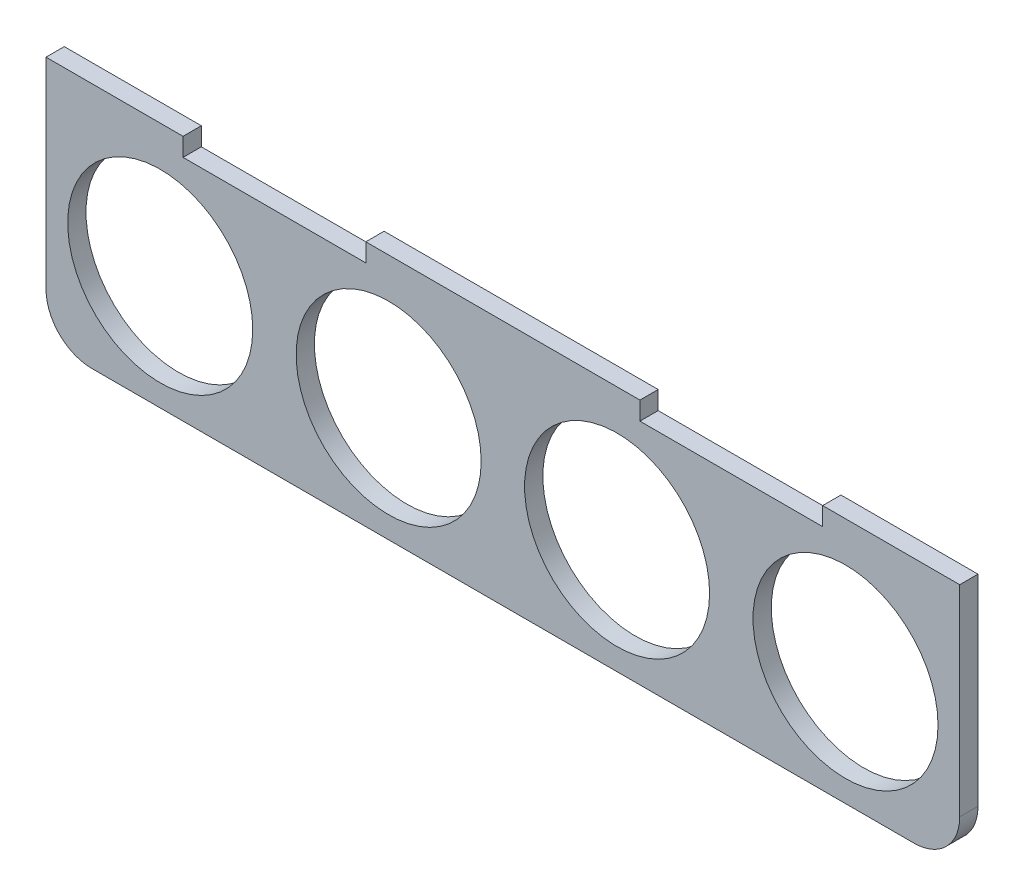
ISO-10303-21;
HEADER;
FILE_DESCRIPTION(('STEP AP214'),'2;1');
FILE_NAME('part.step','',(''),(''),'','','');
FILE_SCHEMA(('AUTOMOTIVE_DESIGN { 1 0 10303 214 1 1 1 1 }'));
ENDSEC;
DATA;
#1=APPLICATION_CONTEXT('core data for automotive mechanical design processes');
#2=APPLICATION_PROTOCOL_DEFINITION('international standard','automotive_design',2000,#1);
#3=PRODUCT_CONTEXT('',#1,'mechanical');
#4=PRODUCT('Part','Part','',(#3));
#5=PRODUCT_RELATED_PRODUCT_CATEGORY('part','',(#4));
#6=PRODUCT_DEFINITION_FORMATION('','',#4);
#7=PRODUCT_DEFINITION_CONTEXT('part definition',#1,'design');
#8=PRODUCT_DEFINITION('design','',#6,#7);
#9=PRODUCT_DEFINITION_SHAPE('','',#8);
#10=(LENGTH_UNIT() NAMED_UNIT(*) SI_UNIT(.MILLI.,.METRE.));
#11=(NAMED_UNIT(*) PLANE_ANGLE_UNIT() SI_UNIT($,.RADIAN.));
#12=(NAMED_UNIT(*) SI_UNIT($,.STERADIAN.) SOLID_ANGLE_UNIT());
#13=UNCERTAINTY_MEASURE_WITH_UNIT(LENGTH_MEASURE(1.E-05),#10,'distance_accuracy_value','');
#14=(GEOMETRIC_REPRESENTATION_CONTEXT(3) GLOBAL_UNCERTAINTY_ASSIGNED_CONTEXT((#13)) GLOBAL_UNIT_ASSIGNED_CONTEXT((#10,
#11,#12)) REPRESENTATION_CONTEXT('',''));
#15=CARTESIAN_POINT('',(0.,0.,0.));
#16=DIRECTION('',(0.,0.,1.));
#17=DIRECTION('',(1.,0.,0.));
#18=AXIS2_PLACEMENT_3D('',#15,#16,#17);
#19=CARTESIAN_POINT('',(10.,10.,4.));
#20=DIRECTION('',(0.,0.,-1.));
#21=DIRECTION('',(-1.,0.,0.));
#22=AXIS2_PLACEMENT_3D('',#19,#20,#21);
#23=PLANE('',#22);
#24=DIRECTION('',(0.,1.,0.));
#25=VECTOR('',#24,1.);
#26=CARTESIAN_POINT('',(200.,50.,4.));
#27=LINE('',#26,#25);
#28=CARTESIAN_POINT('',(200.,10.0000000000001,4.));
#29=VERTEX_POINT('',#28);
#30=CARTESIAN_POINT('',(200.,54.,4.));
#31=VERTEX_POINT('',#30);
#32=EDGE_CURVE('E52',#29,#31,#27,.T.);
#33=ORIENTED_EDGE('',*,*,#32,.T.);
#34=DIRECTION('',(-1.,0.,0.));
#35=VECTOR('',#34,1.);
#36=CARTESIAN_POINT('',(200.,54.,4.));
#37=LINE('',#36,#35);
#38=CARTESIAN_POINT('',(170.,54.,4.));
#39=VERTEX_POINT('',#38);
#40=EDGE_CURVE('E114',#31,#39,#37,.T.);
#41=ORIENTED_EDGE('',*,*,#40,.T.);
#42=DIRECTION('',(0.,-1.,0.));
#43=VECTOR('',#42,1.);
#44=CARTESIAN_POINT('',(170.,50.,4.));
#45=LINE('',#44,#43);
#46=CARTESIAN_POINT('',(170.,50.,4.));
#47=VERTEX_POINT('',#46);
#48=EDGE_CURVE('E231',#39,#47,#45,.T.);
#49=ORIENTED_EDGE('',*,*,#48,.T.);
#50=DIRECTION('',(-1.,0.,0.));
#51=VECTOR('',#50,1.);
#52=CARTESIAN_POINT('',(130.,50.,4.));
#53=LINE('',#52,#51);
#54=CARTESIAN_POINT('',(130.,50.,4.));
#55=VERTEX_POINT('',#54);
#56=EDGE_CURVE('E251',#47,#55,#53,.T.);
#57=ORIENTED_EDGE('',*,*,#56,.T.);
#58=DIRECTION('',(0.,1.,0.));
#59=VECTOR('',#58,1.);
#60=CARTESIAN_POINT('',(130.,50.,4.));
#61=LINE('',#60,#59);
#62=CARTESIAN_POINT('',(130.,54.,4.));
#63=VERTEX_POINT('',#62);
#64=EDGE_CURVE('E248',#55,#63,#61,.T.);
#65=ORIENTED_EDGE('',*,*,#64,.T.);
#66=DIRECTION('',(-1.,0.,0.));
#67=VECTOR('',#66,1.);
#68=CARTESIAN_POINT('',(70.,54.,4.));
#69=LINE('',#68,#67);
#70=CARTESIAN_POINT('',(70.,54.,4.));
#71=VERTEX_POINT('',#70);
#72=EDGE_CURVE('E250',#63,#71,#69,.T.);
#73=ORIENTED_EDGE('',*,*,#72,.T.);
#74=DIRECTION('',(0.,-1.,0.));
#75=VECTOR('',#74,1.);
#76=CARTESIAN_POINT('',(70.,50.,4.));
#77=LINE('',#76,#75);
#78=CARTESIAN_POINT('',(70.,50.,4.));
#79=VERTEX_POINT('',#78);
#80=EDGE_CURVE('E253',#71,#79,#77,.T.);
#81=ORIENTED_EDGE('',*,*,#80,.T.);
#82=DIRECTION('',(-1.,0.,0.));
#83=VECTOR('',#82,1.);
#84=CARTESIAN_POINT('',(30.,50.,4.));
#85=LINE('',#84,#83);
#86=CARTESIAN_POINT('',(30.,50.,4.));
#87=VERTEX_POINT('',#86);
#88=EDGE_CURVE('E259',#79,#87,#85,.T.);
#89=ORIENTED_EDGE('',*,*,#88,.T.);
#90=DIRECTION('',(0.,1.,0.));
#91=VECTOR('',#90,1.);
#92=CARTESIAN_POINT('',(30.,50.,4.));
#93=LINE('',#92,#91);
#94=CARTESIAN_POINT('',(30.,54.,4.));
#95=VERTEX_POINT('',#94);
#96=EDGE_CURVE('E261',#87,#95,#93,.T.);
#97=ORIENTED_EDGE('',*,*,#96,.T.);
#98=DIRECTION('',(-1.,0.,0.));
#99=VECTOR('',#98,1.);
#100=CARTESIAN_POINT('',(0.,54.,4.));
#101=LINE('',#100,#99);
#102=CARTESIAN_POINT('',(0.,54.,4.));
#103=VERTEX_POINT('',#102);
#104=EDGE_CURVE('E263',#95,#103,#101,.T.);
#105=ORIENTED_EDGE('',*,*,#104,.T.);
#106=DIRECTION('',(0.,-1.,0.));
#107=VECTOR('',#106,1.);
#108=CARTESIAN_POINT('',(0.,50.,4.));
#109=LINE('',#108,#107);
#110=CARTESIAN_POINT('',(0.,10.,4.));
#111=VERTEX_POINT('',#110);
#112=EDGE_CURVE('E152',#103,#111,#109,.T.);
#113=ORIENTED_EDGE('',*,*,#112,.T.);
#114=CARTESIAN_POINT('',(10.,10.,4.));
#115=DIRECTION('',(0.,0.,1.));
#116=DIRECTION('',(-1.,0.,0.));
#117=AXIS2_PLACEMENT_3D('',#114,#115,#116);
#118=CIRCLE('',#117,10.);
#119=CARTESIAN_POINT('',(10.0000000000001,0.,4.));
#120=VERTEX_POINT('',#119);
#121=EDGE_CURVE('E146',#111,#120,#118,.T.);
#122=ORIENTED_EDGE('',*,*,#121,.T.);
#123=DIRECTION('',(1.,0.,0.));
#124=VECTOR('',#123,1.);
#125=CARTESIAN_POINT('',(10.0000000000001,0.,4.));
#126=LINE('',#125,#124);
#127=CARTESIAN_POINT('',(190.,0.,4.));
#128=VERTEX_POINT('',#127);
#129=EDGE_CURVE('E150',#120,#128,#126,.T.);
#130=ORIENTED_EDGE('',*,*,#129,.T.);
#131=CARTESIAN_POINT('',(190.,10.,4.));
#132=DIRECTION('',(0.,0.,1.));
#133=DIRECTION('',(1.,0.,0.));
#134=AXIS2_PLACEMENT_3D('',#131,#132,#133);
#135=CIRCLE('',#134,10.);
#136=EDGE_CURVE('E166',#128,#29,#135,.T.);
#137=ORIENTED_EDGE('',*,*,#136,.T.);
#138=EDGE_LOOP('',(#33,#41,#49,#57,#65,#73,#81,#89,#97,#105,#113,#122,#130,#137));
#139=FACE_BOUND('',#138,.T.);
#140=CARTESIAN_POINT('',(25.,25.,4.));
#141=DIRECTION('',(0.,0.,1.));
#142=DIRECTION('',(1.,0.,0.));
#143=AXIS2_PLACEMENT_3D('',#140,#141,#142);
#144=CIRCLE('',#143,20.25);
#145=CARTESIAN_POINT('',(45.25,25.,4.));
#146=VERTEX_POINT('',#145);
#147=EDGE_CURVE('E175',#146,#146,#144,.T.);
#148=ORIENTED_EDGE('',*,*,#147,.F.);
#149=EDGE_LOOP('',(#148));
#150=FACE_BOUND('',#149,.T.);
#151=CARTESIAN_POINT('',(75.,25.,4.));
#152=DIRECTION('',(0.,0.,1.));
#153=DIRECTION('',(1.,0.,0.));
#154=AXIS2_PLACEMENT_3D('',#151,#152,#153);
#155=CIRCLE('',#154,20.25);
#156=CARTESIAN_POINT('',(95.25,25.,4.));
#157=VERTEX_POINT('',#156);
#158=EDGE_CURVE('E281',#157,#157,#155,.T.);
#159=ORIENTED_EDGE('',*,*,#158,.F.);
#160=EDGE_LOOP('',(#159));
#161=FACE_BOUND('',#160,.T.);
#162=CARTESIAN_POINT('',(125.,25.,4.));
#163=DIRECTION('',(0.,0.,1.));
#164=DIRECTION('',(1.,0.,0.));
#165=AXIS2_PLACEMENT_3D('',#162,#163,#164);
#166=CIRCLE('',#165,20.25);
#167=CARTESIAN_POINT('',(145.25,25.,4.));
#168=VERTEX_POINT('',#167);
#169=EDGE_CURVE('E287',#168,#168,#166,.T.);
#170=ORIENTED_EDGE('',*,*,#169,.F.);
#171=EDGE_LOOP('',(#170));
#172=FACE_BOUND('',#171,.T.);
#173=CARTESIAN_POINT('',(175.,25.,4.));
#174=DIRECTION('',(0.,0.,1.));
#175=DIRECTION('',(1.,0.,0.));
#176=AXIS2_PLACEMENT_3D('',#173,#174,#175);
#177=CIRCLE('',#176,20.25);
#178=CARTESIAN_POINT('',(195.25,25.,4.));
#179=VERTEX_POINT('',#178);
#180=EDGE_CURVE('E293',#179,#179,#177,.T.);
#181=ORIENTED_EDGE('',*,*,#180,.F.);
#182=EDGE_LOOP('',(#181));
#183=FACE_BOUND('',#182,.T.);
#184=ADVANCED_FACE('F35',(#139,#150,#161,#172,#183),#23,.F.);
#185=CARTESIAN_POINT('',(10.,10.,0.));
#186=DIRECTION('',(0.,0.,-1.));
#187=DIRECTION('',(-1.,0.,0.));
#188=AXIS2_PLACEMENT_3D('',#185,#186,#187);
#189=PLANE('',#188);
#190=CARTESIAN_POINT('',(125.,25.,0.));
#191=DIRECTION('',(0.,0.,1.));
#192=DIRECTION('',(1.,0.,0.));
#193=AXIS2_PLACEMENT_3D('',#190,#191,#192);
#194=CIRCLE('',#193,20.25);
#195=CARTESIAN_POINT('',(145.25,25.,0.));
#196=VERTEX_POINT('',#195);
#197=EDGE_CURVE('E290',#196,#196,#194,.T.);
#198=ORIENTED_EDGE('',*,*,#197,.T.);
#199=EDGE_LOOP('',(#198));
#200=FACE_BOUND('',#199,.T.);
#201=CARTESIAN_POINT('',(25.,25.,0.));
#202=DIRECTION('',(0.,0.,1.));
#203=DIRECTION('',(1.,0.,0.));
#204=AXIS2_PLACEMENT_3D('',#201,#202,#203);
#205=CIRCLE('',#204,20.25);
#206=CARTESIAN_POINT('',(45.25,25.,0.));
#207=VERTEX_POINT('',#206);
#208=EDGE_CURVE('E278',#207,#207,#205,.T.);
#209=ORIENTED_EDGE('',*,*,#208,.T.);
#210=EDGE_LOOP('',(#209));
#211=FACE_BOUND('',#210,.T.);
#212=DIRECTION('',(-1.,0.,0.));
#213=VECTOR('',#212,1.);
#214=CARTESIAN_POINT('',(200.,54.,0.));
#215=LINE('',#214,#213);
#216=CARTESIAN_POINT('',(200.,54.,0.));
#217=VERTEX_POINT('',#216);
#218=CARTESIAN_POINT('',(170.,54.,0.));
#219=VERTEX_POINT('',#218);
#220=EDGE_CURVE('E172',#217,#219,#215,.T.);
#221=ORIENTED_EDGE('',*,*,#220,.F.);
#222=DIRECTION('',(0.,1.,0.));
#223=VECTOR('',#222,1.);
#224=CARTESIAN_POINT('',(200.,10.0000000000001,0.));
#225=LINE('',#224,#223);
#226=CARTESIAN_POINT('',(200.,10.0000000000001,0.));
#227=VERTEX_POINT('',#226);
#228=EDGE_CURVE('E197',#227,#217,#225,.T.);
#229=ORIENTED_EDGE('',*,*,#228,.F.);
#230=CARTESIAN_POINT('',(190.,10.,0.));
#231=DIRECTION('',(0.,0.,1.));
#232=DIRECTION('',(1.,0.,0.));
#233=AXIS2_PLACEMENT_3D('',#230,#231,#232);
#234=CIRCLE('',#233,10.);
#235=CARTESIAN_POINT('',(190.,0.,0.));
#236=VERTEX_POINT('',#235);
#237=EDGE_CURVE('E107',#236,#227,#234,.T.);
#238=ORIENTED_EDGE('',*,*,#237,.F.);
#239=DIRECTION('',(1.,0.,0.));
#240=VECTOR('',#239,1.);
#241=CARTESIAN_POINT('',(10.0000000000001,0.,0.));
#242=LINE('',#241,#240);
#243=CARTESIAN_POINT('',(10.0000000000001,0.,0.));
#244=VERTEX_POINT('',#243);
#245=EDGE_CURVE('E100',#244,#236,#242,.T.);
#246=ORIENTED_EDGE('',*,*,#245,.F.);
#247=CARTESIAN_POINT('',(10.,10.,0.));
#248=DIRECTION('',(0.,0.,1.));
#249=DIRECTION('',(-1.,0.,0.));
#250=AXIS2_PLACEMENT_3D('',#247,#248,#249);
#251=CIRCLE('',#250,10.);
#252=CARTESIAN_POINT('',(0.,10.,0.));
#253=VERTEX_POINT('',#252);
#254=EDGE_CURVE('E160',#253,#244,#251,.T.);
#255=ORIENTED_EDGE('',*,*,#254,.F.);
#256=DIRECTION('',(0.,-1.,0.));
#257=VECTOR('',#256,1.);
#258=CARTESIAN_POINT('',(0.,10.0000000000001,0.));
#259=LINE('',#258,#257);
#260=CARTESIAN_POINT('',(0.,54.,0.));
#261=VERTEX_POINT('',#260);
#262=EDGE_CURVE('E192',#261,#253,#259,.T.);
#263=ORIENTED_EDGE('',*,*,#262,.F.);
#264=DIRECTION('',(-1.,0.,0.));
#265=VECTOR('',#264,1.);
#266=CARTESIAN_POINT('',(0.,54.,0.));
#267=LINE('',#266,#265);
#268=CARTESIAN_POINT('',(30.,54.,0.));
#269=VERTEX_POINT('',#268);
#270=EDGE_CURVE('E189',#269,#261,#267,.T.);
#271=ORIENTED_EDGE('',*,*,#270,.F.);
#272=DIRECTION('',(0.,1.,0.));
#273=VECTOR('',#272,1.);
#274=CARTESIAN_POINT('',(30.,50.,0.));
#275=LINE('',#274,#273);
#276=CARTESIAN_POINT('',(30.,50.,0.));
#277=VERTEX_POINT('',#276);
#278=EDGE_CURVE('E187',#277,#269,#275,.T.);
#279=ORIENTED_EDGE('',*,*,#278,.F.);
#280=DIRECTION('',(-1.,0.,0.));
#281=VECTOR('',#280,1.);
#282=CARTESIAN_POINT('',(30.,50.,0.));
#283=LINE('',#282,#281);
#284=CARTESIAN_POINT('',(70.,50.,0.));
#285=VERTEX_POINT('',#284);
#286=EDGE_CURVE('E185',#285,#277,#283,.T.);
#287=ORIENTED_EDGE('',*,*,#286,.F.);
#288=DIRECTION('',(0.,-1.,0.));
#289=VECTOR('',#288,1.);
#290=CARTESIAN_POINT('',(70.,50.,0.));
#291=LINE('',#290,#289);
#292=CARTESIAN_POINT('',(70.,54.,0.));
#293=VERTEX_POINT('',#292);
#294=EDGE_CURVE('E183',#293,#285,#291,.T.);
#295=ORIENTED_EDGE('',*,*,#294,.F.);
#296=DIRECTION('',(-1.,0.,0.));
#297=VECTOR('',#296,1.);
#298=CARTESIAN_POINT('',(70.,54.,0.));
#299=LINE('',#298,#297);
#300=CARTESIAN_POINT('',(130.,54.,0.));
#301=VERTEX_POINT('',#300);
#302=EDGE_CURVE('E181',#301,#293,#299,.T.);
#303=ORIENTED_EDGE('',*,*,#302,.F.);
#304=DIRECTION('',(0.,1.,0.));
#305=VECTOR('',#304,1.);
#306=CARTESIAN_POINT('',(130.,50.,0.));
#307=LINE('',#306,#305);
#308=CARTESIAN_POINT('',(130.,50.,0.));
#309=VERTEX_POINT('',#308);
#310=EDGE_CURVE('E179',#309,#301,#307,.T.);
#311=ORIENTED_EDGE('',*,*,#310,.F.);
#312=DIRECTION('',(-1.,0.,0.));
#313=VECTOR('',#312,1.);
#314=CARTESIAN_POINT('',(130.,50.,0.));
#315=LINE('',#314,#313);
#316=CARTESIAN_POINT('',(170.,50.,0.));
#317=VERTEX_POINT('',#316);
#318=EDGE_CURVE('E177',#317,#309,#315,.T.);
#319=ORIENTED_EDGE('',*,*,#318,.F.);
#320=DIRECTION('',(0.,-1.,0.));
#321=VECTOR('',#320,1.);
#322=CARTESIAN_POINT('',(170.,50.,0.));
#323=LINE('',#322,#321);
#324=EDGE_CURVE('E174',#219,#317,#323,.T.);
#325=ORIENTED_EDGE('',*,*,#324,.F.);
#326=EDGE_LOOP('',(#221,#229,#238,#246,#255,#263,#271,#279,#287,#295,#303,#311,#319,#325));
#327=FACE_BOUND('',#326,.T.);
#328=CARTESIAN_POINT('',(75.,25.,0.));
#329=DIRECTION('',(0.,0.,1.));
#330=DIRECTION('',(1.,0.,0.));
#331=AXIS2_PLACEMENT_3D('',#328,#329,#330);
#332=CIRCLE('',#331,20.25);
#333=CARTESIAN_POINT('',(95.25,25.,0.));
#334=VERTEX_POINT('',#333);
#335=EDGE_CURVE('E284',#334,#334,#332,.T.);
#336=ORIENTED_EDGE('',*,*,#335,.T.);
#337=EDGE_LOOP('',(#336));
#338=FACE_BOUND('',#337,.T.);
#339=CARTESIAN_POINT('',(175.,25.,0.));
#340=DIRECTION('',(0.,0.,1.));
#341=DIRECTION('',(1.,0.,0.));
#342=AXIS2_PLACEMENT_3D('',#339,#340,#341);
#343=CIRCLE('',#342,20.25);
#344=CARTESIAN_POINT('',(195.25,25.,0.));
#345=VERTEX_POINT('',#344);
#346=EDGE_CURVE('E296',#345,#345,#343,.T.);
#347=ORIENTED_EDGE('',*,*,#346,.T.);
#348=EDGE_LOOP('',(#347));
#349=FACE_BOUND('',#348,.T.);
#350=ADVANCED_FACE('F235',(#200,#211,#327,#338,#349),#189,.T.);
#351=CARTESIAN_POINT('',(200.,54.,4.));
#352=DIRECTION('',(0.,-1.,0.));
#353=DIRECTION('',(1.,0.,0.));
#354=AXIS2_PLACEMENT_3D('',#351,#352,#353);
#355=PLANE('',#354);
#356=ORIENTED_EDGE('',*,*,#220,.T.);
#357=DIRECTION('',(0.,0.,-1.));
#358=VECTOR('',#357,1.);
#359=CARTESIAN_POINT('',(170.,54.,4.));
#360=LINE('',#359,#358);
#361=EDGE_CURVE('E44',#39,#219,#360,.T.);
#362=ORIENTED_EDGE('',*,*,#361,.F.);
#363=ORIENTED_EDGE('',*,*,#40,.F.);
#364=DIRECTION('',(0.,0.,-1.));
#365=VECTOR('',#364,1.);
#366=CARTESIAN_POINT('',(200.,54.,4.));
#367=LINE('',#366,#365);
#368=EDGE_CURVE('E11',#31,#217,#367,.T.);
#369=ORIENTED_EDGE('',*,*,#368,.T.);
#370=EDGE_LOOP('',(#356,#362,#363,#369));
#371=FACE_BOUND('',#370,.T.);
#372=ADVANCED_FACE('F37',(#371),#355,.F.);
#373=CARTESIAN_POINT('',(170.,50.,4.));
#374=DIRECTION('',(1.,0.,0.));
#375=DIRECTION('',(0.,0.,-1.));
#376=AXIS2_PLACEMENT_3D('',#373,#374,#375);
#377=PLANE('',#376);
#378=ORIENTED_EDGE('',*,*,#324,.T.);
#379=DIRECTION('',(0.,0.,-1.));
#380=VECTOR('',#379,1.);
#381=CARTESIAN_POINT('',(170.,50.,4.));
#382=LINE('',#381,#380);
#383=EDGE_CURVE('E223',#47,#317,#382,.T.);
#384=ORIENTED_EDGE('',*,*,#383,.F.);
#385=ORIENTED_EDGE('',*,*,#48,.F.);
#386=ORIENTED_EDGE('',*,*,#361,.T.);
#387=EDGE_LOOP('',(#378,#384,#385,#386));
#388=FACE_BOUND('',#387,.T.);
#389=ADVANCED_FACE('F229',(#388),#377,.F.);
#390=CARTESIAN_POINT('',(130.,50.,4.));
#391=DIRECTION('',(0.,-1.,0.));
#392=DIRECTION('',(1.,0.,0.));
#393=AXIS2_PLACEMENT_3D('',#390,#391,#392);
#394=PLANE('',#393);
#395=ORIENTED_EDGE('',*,*,#318,.T.);
#396=DIRECTION('',(0.,0.,-1.));
#397=VECTOR('',#396,1.);
#398=CARTESIAN_POINT('',(130.,50.,4.));
#399=LINE('',#398,#397);
#400=EDGE_CURVE('E220',#55,#309,#399,.T.);
#401=ORIENTED_EDGE('',*,*,#400,.F.);
#402=ORIENTED_EDGE('',*,*,#56,.F.);
#403=ORIENTED_EDGE('',*,*,#383,.T.);
#404=EDGE_LOOP('',(#395,#401,#402,#403));
#405=FACE_BOUND('',#404,.T.);
#406=ADVANCED_FACE('F242',(#405),#394,.F.);
#407=CARTESIAN_POINT('',(130.,50.,4.));
#408=DIRECTION('',(-1.,0.,0.));
#409=DIRECTION('',(0.,0.,1.));
#410=AXIS2_PLACEMENT_3D('',#407,#408,#409);
#411=PLANE('',#410);
#412=ORIENTED_EDGE('',*,*,#310,.T.);
#413=DIRECTION('',(0.,0.,-1.));
#414=VECTOR('',#413,1.);
#415=CARTESIAN_POINT('',(130.,54.,4.));
#416=LINE('',#415,#414);
#417=EDGE_CURVE('E217',#63,#301,#416,.T.);
#418=ORIENTED_EDGE('',*,*,#417,.F.);
#419=ORIENTED_EDGE('',*,*,#64,.F.);
#420=ORIENTED_EDGE('',*,*,#400,.T.);
#421=EDGE_LOOP('',(#412,#418,#419,#420));
#422=FACE_BOUND('',#421,.T.);
#423=ADVANCED_FACE('F246',(#422),#411,.F.);
#424=CARTESIAN_POINT('',(70.,54.,4.));
#425=DIRECTION('',(0.,-1.,0.));
#426=DIRECTION('',(0.,0.,-1.));
#427=AXIS2_PLACEMENT_3D('',#424,#425,#426);
#428=PLANE('',#427);
#429=ORIENTED_EDGE('',*,*,#302,.T.);
#430=DIRECTION('',(0.,0.,-1.));
#431=VECTOR('',#430,1.);
#432=CARTESIAN_POINT('',(70.,54.,4.));
#433=LINE('',#432,#431);
#434=EDGE_CURVE('E214',#71,#293,#433,.T.);
#435=ORIENTED_EDGE('',*,*,#434,.F.);
#436=ORIENTED_EDGE('',*,*,#72,.F.);
#437=ORIENTED_EDGE('',*,*,#417,.T.);
#438=EDGE_LOOP('',(#429,#435,#436,#437));
#439=FACE_BOUND('',#438,.T.);
#440=ADVANCED_FACE('F339',(#439),#428,.F.);
#441=CARTESIAN_POINT('',(70.,50.,4.));
#442=DIRECTION('',(1.,0.,0.));
#443=DIRECTION('',(0.,0.,-1.));
#444=AXIS2_PLACEMENT_3D('',#441,#442,#443);
#445=PLANE('',#444);
#446=ORIENTED_EDGE('',*,*,#294,.T.);
#447=DIRECTION('',(0.,0.,-1.));
#448=VECTOR('',#447,1.);
#449=CARTESIAN_POINT('',(70.,50.,4.));
#450=LINE('',#449,#448);
#451=EDGE_CURVE('E211',#79,#285,#450,.T.);
#452=ORIENTED_EDGE('',*,*,#451,.F.);
#453=ORIENTED_EDGE('',*,*,#80,.F.);
#454=ORIENTED_EDGE('',*,*,#434,.T.);
#455=EDGE_LOOP('',(#446,#452,#453,#454));
#456=FACE_BOUND('',#455,.T.);
#457=ADVANCED_FACE('F335',(#456),#445,.F.);
#458=CARTESIAN_POINT('',(30.,50.,4.));
#459=DIRECTION('',(0.,-1.,0.));
#460=DIRECTION('',(0.,0.,-1.));
#461=AXIS2_PLACEMENT_3D('',#458,#459,#460);
#462=PLANE('',#461);
#463=ORIENTED_EDGE('',*,*,#286,.T.);
#464=DIRECTION('',(0.,0.,-1.));
#465=VECTOR('',#464,1.);
#466=CARTESIAN_POINT('',(30.,50.,4.));
#467=LINE('',#466,#465);
#468=EDGE_CURVE('E208',#87,#277,#467,.T.);
#469=ORIENTED_EDGE('',*,*,#468,.F.);
#470=ORIENTED_EDGE('',*,*,#88,.F.);
#471=ORIENTED_EDGE('',*,*,#451,.T.);
#472=EDGE_LOOP('',(#463,#469,#470,#471));
#473=FACE_BOUND('',#472,.T.);
#474=ADVANCED_FACE('F331',(#473),#462,.F.);
#475=CARTESIAN_POINT('',(30.,50.,4.));
#476=DIRECTION('',(-1.,0.,0.));
#477=DIRECTION('',(0.,0.,1.));
#478=AXIS2_PLACEMENT_3D('',#475,#476,#477);
#479=PLANE('',#478);
#480=ORIENTED_EDGE('',*,*,#278,.T.);
#481=DIRECTION('',(0.,0.,-1.));
#482=VECTOR('',#481,1.);
#483=CARTESIAN_POINT('',(30.,54.,4.));
#484=LINE('',#483,#482);
#485=EDGE_CURVE('E205',#95,#269,#484,.T.);
#486=ORIENTED_EDGE('',*,*,#485,.F.);
#487=ORIENTED_EDGE('',*,*,#96,.F.);
#488=ORIENTED_EDGE('',*,*,#468,.T.);
#489=EDGE_LOOP('',(#480,#486,#487,#488));
#490=FACE_BOUND('',#489,.T.);
#491=ADVANCED_FACE('F328',(#490),#479,.F.);
#492=CARTESIAN_POINT('',(0.,54.,4.));
#493=DIRECTION('',(0.,-1.,0.));
#494=DIRECTION('',(0.,0.,-1.));
#495=AXIS2_PLACEMENT_3D('',#492,#493,#494);
#496=PLANE('',#495);
#497=ORIENTED_EDGE('',*,*,#270,.T.);
#498=DIRECTION('',(0.,0.,-1.));
#499=VECTOR('',#498,1.);
#500=CARTESIAN_POINT('',(0.,54.,4.));
#501=LINE('',#500,#499);
#502=EDGE_CURVE('E202',#103,#261,#501,.T.);
#503=ORIENTED_EDGE('',*,*,#502,.F.);
#504=ORIENTED_EDGE('',*,*,#104,.F.);
#505=ORIENTED_EDGE('',*,*,#485,.T.);
#506=EDGE_LOOP('',(#497,#503,#504,#505));
#507=FACE_BOUND('',#506,.T.);
#508=ADVANCED_FACE('F269',(#507),#496,.F.);
#509=CARTESIAN_POINT('',(0.,10.0000000000001,4.));
#510=DIRECTION('',(1.,0.,0.));
#511=DIRECTION('',(0.,0.,-1.));
#512=AXIS2_PLACEMENT_3D('',#509,#510,#511);
#513=PLANE('',#512);
#514=ORIENTED_EDGE('',*,*,#262,.T.);
#515=DIRECTION('',(0.,0.,-1.));
#516=VECTOR('',#515,1.);
#517=CARTESIAN_POINT('',(0.,10.,4.));
#518=LINE('',#517,#516);
#519=EDGE_CURVE('E161',#111,#253,#518,.T.);
#520=ORIENTED_EDGE('',*,*,#519,.F.);
#521=ORIENTED_EDGE('',*,*,#112,.F.);
#522=ORIENTED_EDGE('',*,*,#502,.T.);
#523=EDGE_LOOP('',(#514,#520,#521,#522));
#524=FACE_BOUND('',#523,.T.);
#525=ADVANCED_FACE('F272',(#524),#513,.F.);
#526=CARTESIAN_POINT('',(10.,10.,4.));
#527=DIRECTION('',(0.,0.,-1.));
#528=DIRECTION('',(-1.,0.,0.));
#529=AXIS2_PLACEMENT_3D('',#526,#527,#528);
#530=CYLINDRICAL_SURFACE('',#529,10.);
#531=ORIENTED_EDGE('',*,*,#254,.T.);
#532=DIRECTION('',(0.,0.,-1.));
#533=VECTOR('',#532,1.);
#534=CARTESIAN_POINT('',(10.0000000000001,0.,4.));
#535=LINE('',#534,#533);
#536=EDGE_CURVE('E157',#120,#244,#535,.T.);
#537=ORIENTED_EDGE('',*,*,#536,.F.);
#538=ORIENTED_EDGE('',*,*,#121,.F.);
#539=ORIENTED_EDGE('',*,*,#519,.T.);
#540=EDGE_LOOP('',(#531,#537,#538,#539));
#541=FACE_BOUND('',#540,.T.);
#542=ADVANCED_FACE('F158',(#541),#530,.T.);
#543=CARTESIAN_POINT('',(10.0000000000001,0.,4.));
#544=DIRECTION('',(0.,1.,0.));
#545=DIRECTION('',(0.,0.,1.));
#546=AXIS2_PLACEMENT_3D('',#543,#544,#545);
#547=PLANE('',#546);
#548=ORIENTED_EDGE('',*,*,#245,.T.);
#549=DIRECTION('',(0.,0.,-1.));
#550=VECTOR('',#549,1.);
#551=CARTESIAN_POINT('',(190.,0.,4.));
#552=LINE('',#551,#550);
#553=EDGE_CURVE('E162',#128,#236,#552,.T.);
#554=ORIENTED_EDGE('',*,*,#553,.F.);
#555=ORIENTED_EDGE('',*,*,#129,.F.);
#556=ORIENTED_EDGE('',*,*,#536,.T.);
#557=EDGE_LOOP('',(#548,#554,#555,#556));
#558=FACE_BOUND('',#557,.T.);
#559=ADVANCED_FACE('F164',(#558),#547,.F.);
#560=CARTESIAN_POINT('',(190.,10.,4.));
#561=DIRECTION('',(0.,0.,-1.));
#562=DIRECTION('',(-1.,0.,0.));
#563=AXIS2_PLACEMENT_3D('',#560,#561,#562);
#564=CYLINDRICAL_SURFACE('',#563,10.);
#565=ORIENTED_EDGE('',*,*,#237,.T.);
#566=DIRECTION('',(0.,0.,-1.));
#567=VECTOR('',#566,1.);
#568=CARTESIAN_POINT('',(200.,10.0000000000001,4.));
#569=LINE('',#568,#567);
#570=EDGE_CURVE('E168',#29,#227,#569,.T.);
#571=ORIENTED_EDGE('',*,*,#570,.F.);
#572=ORIENTED_EDGE('',*,*,#136,.F.);
#573=ORIENTED_EDGE('',*,*,#553,.T.);
#574=EDGE_LOOP('',(#565,#571,#572,#573));
#575=FACE_BOUND('',#574,.T.);
#576=ADVANCED_FACE('F274',(#575),#564,.T.);
#577=CARTESIAN_POINT('',(200.,10.0000000000001,4.));
#578=DIRECTION('',(-1.,0.,0.));
#579=DIRECTION('',(0.,0.,1.));
#580=AXIS2_PLACEMENT_3D('',#577,#578,#579);
#581=PLANE('',#580);
#582=ORIENTED_EDGE('',*,*,#228,.T.);
#583=ORIENTED_EDGE('',*,*,#368,.F.);
#584=ORIENTED_EDGE('',*,*,#32,.F.);
#585=ORIENTED_EDGE('',*,*,#570,.T.);
#586=EDGE_LOOP('',(#582,#583,#584,#585));
#587=FACE_BOUND('',#586,.T.);
#588=ADVANCED_FACE('F273',(#587),#581,.F.);
#589=CARTESIAN_POINT('',(25.,25.,4.));
#590=DIRECTION('',(0.,0.,-1.));
#591=DIRECTION('',(-1.,0.,0.));
#592=AXIS2_PLACEMENT_3D('',#589,#590,#591);
#593=CYLINDRICAL_SURFACE('',#592,20.25);
#594=ORIENTED_EDGE('',*,*,#147,.T.);
#595=EDGE_LOOP('',(#594));
#596=FACE_BOUND('',#595,.T.);
#597=ORIENTED_EDGE('',*,*,#208,.F.);
#598=EDGE_LOOP('',(#597));
#599=FACE_BOUND('',#598,.T.);
#600=ADVANCED_FACE('F313',(#596,#599),#593,.F.);
#601=CARTESIAN_POINT('',(75.,25.,4.));
#602=DIRECTION('',(0.,0.,-1.));
#603=DIRECTION('',(-1.,0.,0.));
#604=AXIS2_PLACEMENT_3D('',#601,#602,#603);
#605=CYLINDRICAL_SURFACE('',#604,20.25);
#606=ORIENTED_EDGE('',*,*,#158,.T.);
#607=EDGE_LOOP('',(#606));
#608=FACE_BOUND('',#607,.T.);
#609=ORIENTED_EDGE('',*,*,#335,.F.);
#610=EDGE_LOOP('',(#609));
#611=FACE_BOUND('',#610,.T.);
#612=ADVANCED_FACE('F443',(#608,#611),#605,.F.);
#613=CARTESIAN_POINT('',(125.,25.,4.));
#614=DIRECTION('',(0.,0.,-1.));
#615=DIRECTION('',(-1.,0.,0.));
#616=AXIS2_PLACEMENT_3D('',#613,#614,#615);
#617=CYLINDRICAL_SURFACE('',#616,20.25);
#618=ORIENTED_EDGE('',*,*,#169,.T.);
#619=EDGE_LOOP('',(#618));
#620=FACE_BOUND('',#619,.T.);
#621=ORIENTED_EDGE('',*,*,#197,.F.);
#622=EDGE_LOOP('',(#621));
#623=FACE_BOUND('',#622,.T.);
#624=ADVANCED_FACE('F451',(#620,#623),#617,.F.);
#625=CARTESIAN_POINT('',(175.,25.,4.));
#626=DIRECTION('',(0.,0.,-1.));
#627=DIRECTION('',(-1.,0.,0.));
#628=AXIS2_PLACEMENT_3D('',#625,#626,#627);
#629=CYLINDRICAL_SURFACE('',#628,20.25);
#630=ORIENTED_EDGE('',*,*,#180,.T.);
#631=EDGE_LOOP('',(#630));
#632=FACE_BOUND('',#631,.T.);
#633=ORIENTED_EDGE('',*,*,#346,.F.);
#634=EDGE_LOOP('',(#633));
#635=FACE_BOUND('',#634,.T.);
#636=ADVANCED_FACE('F302',(#632,#635),#629,.F.);
#637=CLOSED_SHELL('',(#184,#350,#372,#389,#406,#423,#440,#457,#474,#491,#508,#525,#542,#559,
#576,#588,#600,#612,#624,#636));
#638=MANIFOLD_SOLID_BREP('B2',#637);
#639=ADVANCED_BREP_SHAPE_REPRESENTATION('',(#18,#638),#14);
#640=SHAPE_DEFINITION_REPRESENTATION(#9,#639);
ENDSEC;
END-ISO-10303-21;
